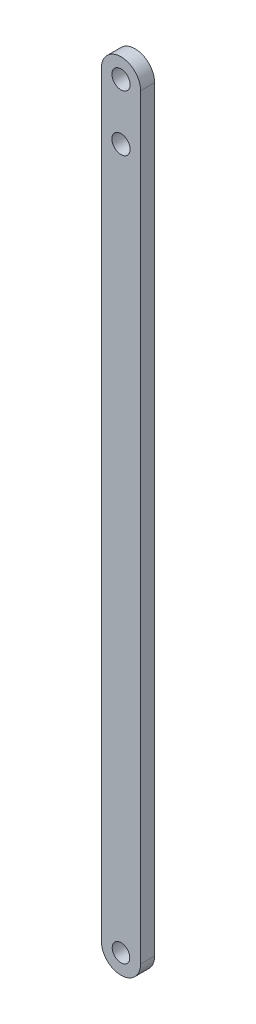
ISO-10303-21;
HEADER;
FILE_DESCRIPTION(('STEP AP214'),'2;1');
FILE_NAME('part.step','',(''),(''),'','','');
FILE_SCHEMA(('AUTOMOTIVE_DESIGN { 1 0 10303 214 1 1 1 1 }'));
ENDSEC;
DATA;
#1=APPLICATION_CONTEXT('core data for automotive mechanical design processes');
#2=APPLICATION_PROTOCOL_DEFINITION('international standard','automotive_design',2000,#1);
#3=PRODUCT_CONTEXT('',#1,'mechanical');
#4=PRODUCT('Part','Part','',(#3));
#5=PRODUCT_RELATED_PRODUCT_CATEGORY('part','',(#4));
#6=PRODUCT_DEFINITION_FORMATION('','',#4);
#7=PRODUCT_DEFINITION_CONTEXT('part definition',#1,'design');
#8=PRODUCT_DEFINITION('design','',#6,#7);
#9=PRODUCT_DEFINITION_SHAPE('','',#8);
#10=(LENGTH_UNIT() NAMED_UNIT(*) SI_UNIT(.MILLI.,.METRE.));
#11=(NAMED_UNIT(*) PLANE_ANGLE_UNIT() SI_UNIT($,.RADIAN.));
#12=(NAMED_UNIT(*) SI_UNIT($,.STERADIAN.) SOLID_ANGLE_UNIT());
#13=UNCERTAINTY_MEASURE_WITH_UNIT(LENGTH_MEASURE(1.E-05),#10,'distance_accuracy_value','');
#14=(GEOMETRIC_REPRESENTATION_CONTEXT(3) GLOBAL_UNCERTAINTY_ASSIGNED_CONTEXT((#13)) GLOBAL_UNIT_ASSIGNED_CONTEXT((#10,
#11,#12)) REPRESENTATION_CONTEXT('',''));
#15=CARTESIAN_POINT('',(0.,0.,0.));
#16=DIRECTION('',(0.,0.,1.));
#17=DIRECTION('',(1.,0.,0.));
#18=AXIS2_PLACEMENT_3D('',#15,#16,#17);
#19=CARTESIAN_POINT('',(0.,0.,5.));
#20=DIRECTION('',(0.,0.,1.));
#21=DIRECTION('',(1.,0.,0.));
#22=AXIS2_PLACEMENT_3D('',#19,#20,#21);
#23=PLANE('',#22);
#24=CARTESIAN_POINT('',(0.,270.,5.));
#25=DIRECTION('',(0.,0.,1.));
#26=DIRECTION('',(1.,0.,0.));
#27=AXIS2_PLACEMENT_3D('',#24,#25,#26);
#28=CIRCLE('',#27,3.25);
#29=CARTESIAN_POINT('',(3.25,270.,5.));
#30=VERTEX_POINT('',#29);
#31=EDGE_CURVE('E132',#30,#30,#28,.T.);
#32=ORIENTED_EDGE('',*,*,#31,.F.);
#33=EDGE_LOOP('',(#32));
#34=FACE_BOUND('',#33,.T.);
#35=CARTESIAN_POINT('',(0.,250.,5.));
#36=DIRECTION('',(0.,0.,1.));
#37=DIRECTION('',(1.,0.,0.));
#38=AXIS2_PLACEMENT_3D('',#35,#36,#37);
#39=CIRCLE('',#38,3.25);
#40=CARTESIAN_POINT('',(3.25,250.,5.));
#41=VERTEX_POINT('',#40);
#42=EDGE_CURVE('E140',#41,#41,#39,.T.);
#43=ORIENTED_EDGE('',*,*,#42,.F.);
#44=EDGE_LOOP('',(#43));
#45=FACE_BOUND('',#44,.T.);
#46=CARTESIAN_POINT('',(0.,0.,5.));
#47=DIRECTION('',(0.,0.,1.));
#48=DIRECTION('',(1.,0.,0.));
#49=AXIS2_PLACEMENT_3D('',#46,#47,#48);
#50=CIRCLE('',#49,7.00000000000002);
#51=CARTESIAN_POINT('',(-7.00000000000002,0.,5.));
#52=VERTEX_POINT('',#51);
#53=CARTESIAN_POINT('',(7.00000000000002,0.,5.));
#54=VERTEX_POINT('',#53);
#55=EDGE_CURVE('E98',#52,#54,#50,.T.);
#56=ORIENTED_EDGE('',*,*,#55,.T.);
#57=DIRECTION('',(0.,1.,0.));
#58=VECTOR('',#57,1.);
#59=CARTESIAN_POINT('',(7.,270.,5.));
#60=LINE('',#59,#58);
#61=CARTESIAN_POINT('',(6.99999999999999,270.,5.));
#62=VERTEX_POINT('',#61);
#63=EDGE_CURVE('E93',#54,#62,#60,.T.);
#64=ORIENTED_EDGE('',*,*,#63,.T.);
#65=CARTESIAN_POINT('',(0.,270.,5.));
#66=DIRECTION('',(0.,0.,1.));
#67=DIRECTION('',(1.,0.,0.));
#68=AXIS2_PLACEMENT_3D('',#65,#66,#67);
#69=CIRCLE('',#68,7.);
#70=CARTESIAN_POINT('',(-7.,270.,5.));
#71=VERTEX_POINT('',#70);
#72=EDGE_CURVE('E96',#62,#71,#69,.T.);
#73=ORIENTED_EDGE('',*,*,#72,.T.);
#74=DIRECTION('',(0.,-1.,0.));
#75=VECTOR('',#74,1.);
#76=CARTESIAN_POINT('',(-7.,270.,5.));
#77=LINE('',#76,#75);
#78=EDGE_CURVE('E63',#71,#52,#77,.T.);
#79=ORIENTED_EDGE('',*,*,#78,.T.);
#80=EDGE_LOOP('',(#56,#64,#73,#79));
#81=FACE_BOUND('',#80,.T.);
#82=CARTESIAN_POINT('',(0.,0.,5.));
#83=DIRECTION('',(0.,0.,1.));
#84=DIRECTION('',(1.,0.,0.));
#85=AXIS2_PLACEMENT_3D('',#82,#83,#84);
#86=CIRCLE('',#85,3.13055518278881);
#87=CARTESIAN_POINT('',(3.13055518278881,0.,5.));
#88=VERTEX_POINT('',#87);
#89=EDGE_CURVE('E119',#88,#88,#86,.T.);
#90=ORIENTED_EDGE('',*,*,#89,.F.);
#91=EDGE_LOOP('',(#90));
#92=FACE_BOUND('',#91,.T.);
#93=ADVANCED_FACE('F43',(#34,#45,#81,#92),#23,.T.);
#94=CARTESIAN_POINT('',(0.,0.,0.));
#95=DIRECTION('',(0.,0.,1.));
#96=DIRECTION('',(1.,0.,0.));
#97=AXIS2_PLACEMENT_3D('',#94,#95,#96);
#98=PLANE('',#97);
#99=CARTESIAN_POINT('',(0.,270.,0.));
#100=DIRECTION('',(0.,0.,1.));
#101=DIRECTION('',(1.,0.,0.));
#102=AXIS2_PLACEMENT_3D('',#99,#100,#101);
#103=CIRCLE('',#102,3.25);
#104=CARTESIAN_POINT('',(3.25,270.,0.));
#105=VERTEX_POINT('',#104);
#106=EDGE_CURVE('E47',#105,#105,#103,.T.);
#107=ORIENTED_EDGE('',*,*,#106,.T.);
#108=EDGE_LOOP('',(#107));
#109=FACE_BOUND('',#108,.T.);
#110=CARTESIAN_POINT('',(0.,250.,0.));
#111=DIRECTION('',(0.,0.,1.));
#112=DIRECTION('',(1.,0.,0.));
#113=AXIS2_PLACEMENT_3D('',#110,#111,#112);
#114=CIRCLE('',#113,3.25);
#115=CARTESIAN_POINT('',(3.25,250.,0.));
#116=VERTEX_POINT('',#115);
#117=EDGE_CURVE('E129',#116,#116,#114,.T.);
#118=ORIENTED_EDGE('',*,*,#117,.T.);
#119=EDGE_LOOP('',(#118));
#120=FACE_BOUND('',#119,.T.);
#121=CARTESIAN_POINT('',(0.,0.,0.));
#122=DIRECTION('',(0.,0.,1.));
#123=DIRECTION('',(1.,0.,0.));
#124=AXIS2_PLACEMENT_3D('',#121,#122,#123);
#125=CIRCLE('',#124,7.00000000000002);
#126=CARTESIAN_POINT('',(-7.00000000000002,0.,0.));
#127=VERTEX_POINT('',#126);
#128=CARTESIAN_POINT('',(7.00000000000002,0.,0.));
#129=VERTEX_POINT('',#128);
#130=EDGE_CURVE('E115',#127,#129,#125,.T.);
#131=ORIENTED_EDGE('',*,*,#130,.F.);
#132=DIRECTION('',(0.,-1.,0.));
#133=VECTOR('',#132,1.);
#134=CARTESIAN_POINT('',(-7.,270.,0.));
#135=LINE('',#134,#133);
#136=CARTESIAN_POINT('',(-7.,270.,0.));
#137=VERTEX_POINT('',#136);
#138=EDGE_CURVE('E86',#137,#127,#135,.T.);
#139=ORIENTED_EDGE('',*,*,#138,.F.);
#140=CARTESIAN_POINT('',(0.,270.,0.));
#141=DIRECTION('',(0.,0.,1.));
#142=DIRECTION('',(1.,0.,0.));
#143=AXIS2_PLACEMENT_3D('',#140,#141,#142);
#144=CIRCLE('',#143,7.);
#145=CARTESIAN_POINT('',(6.99999999999999,270.,0.));
#146=VERTEX_POINT('',#145);
#147=EDGE_CURVE('E80',#146,#137,#144,.T.);
#148=ORIENTED_EDGE('',*,*,#147,.F.);
#149=DIRECTION('',(0.,1.,0.));
#150=VECTOR('',#149,1.);
#151=CARTESIAN_POINT('',(7.,270.,0.));
#152=LINE('',#151,#150);
#153=EDGE_CURVE('E103',#129,#146,#152,.T.);
#154=ORIENTED_EDGE('',*,*,#153,.F.);
#155=EDGE_LOOP('',(#131,#139,#148,#154));
#156=FACE_BOUND('',#155,.T.);
#157=CARTESIAN_POINT('',(0.,0.,0.));
#158=DIRECTION('',(0.,0.,1.));
#159=DIRECTION('',(1.,0.,0.));
#160=AXIS2_PLACEMENT_3D('',#157,#158,#159);
#161=CIRCLE('',#160,3.13055518278881);
#162=CARTESIAN_POINT('',(3.13055518278881,0.,0.));
#163=VERTEX_POINT('',#162);
#164=EDGE_CURVE('E138',#163,#163,#161,.T.);
#165=ORIENTED_EDGE('',*,*,#164,.T.);
#166=EDGE_LOOP('',(#165));
#167=FACE_BOUND('',#166,.T.);
#168=ADVANCED_FACE('F156',(#109,#120,#156,#167),#98,.F.);
#169=CARTESIAN_POINT('',(0.,0.,5.));
#170=DIRECTION('',(0.,0.,-1.));
#171=DIRECTION('',(-1.,0.,0.));
#172=AXIS2_PLACEMENT_3D('',#169,#170,#171);
#173=CYLINDRICAL_SURFACE('',#172,7.00000000000002);
#174=ORIENTED_EDGE('',*,*,#130,.T.);
#175=DIRECTION('',(0.,0.,-1.));
#176=VECTOR('',#175,1.);
#177=CARTESIAN_POINT('',(7.00000000000002,0.,5.));
#178=LINE('',#177,#176);
#179=EDGE_CURVE('E11',#54,#129,#178,.T.);
#180=ORIENTED_EDGE('',*,*,#179,.F.);
#181=ORIENTED_EDGE('',*,*,#55,.F.);
#182=DIRECTION('',(0.,0.,-1.));
#183=VECTOR('',#182,1.);
#184=CARTESIAN_POINT('',(-7.00000000000002,0.,5.));
#185=LINE('',#184,#183);
#186=EDGE_CURVE('E111',#52,#127,#185,.T.);
#187=ORIENTED_EDGE('',*,*,#186,.T.);
#188=EDGE_LOOP('',(#174,#180,#181,#187));
#189=FACE_BOUND('',#188,.T.);
#190=ADVANCED_FACE('F45',(#189),#173,.T.);
#191=CARTESIAN_POINT('',(7.,270.,5.));
#192=DIRECTION('',(-1.,0.,0.));
#193=DIRECTION('',(0.,-1.,0.));
#194=AXIS2_PLACEMENT_3D('',#191,#192,#193);
#195=PLANE('',#194);
#196=ORIENTED_EDGE('',*,*,#153,.T.);
#197=DIRECTION('',(0.,0.,-1.));
#198=VECTOR('',#197,1.);
#199=CARTESIAN_POINT('',(6.99999999999999,270.,5.));
#200=LINE('',#199,#198);
#201=EDGE_CURVE('E54',#62,#146,#200,.T.);
#202=ORIENTED_EDGE('',*,*,#201,.F.);
#203=ORIENTED_EDGE('',*,*,#63,.F.);
#204=ORIENTED_EDGE('',*,*,#179,.T.);
#205=EDGE_LOOP('',(#196,#202,#203,#204));
#206=FACE_BOUND('',#205,.T.);
#207=ADVANCED_FACE('F102',(#206),#195,.F.);
#208=CARTESIAN_POINT('',(0.,270.,5.));
#209=DIRECTION('',(0.,0.,-1.));
#210=DIRECTION('',(-1.,0.,0.));
#211=AXIS2_PLACEMENT_3D('',#208,#209,#210);
#212=CYLINDRICAL_SURFACE('',#211,7.);
#213=ORIENTED_EDGE('',*,*,#147,.T.);
#214=DIRECTION('',(0.,0.,-1.));
#215=VECTOR('',#214,1.);
#216=CARTESIAN_POINT('',(-7.,270.,5.));
#217=LINE('',#216,#215);
#218=EDGE_CURVE('E105',#71,#137,#217,.T.);
#219=ORIENTED_EDGE('',*,*,#218,.F.);
#220=ORIENTED_EDGE('',*,*,#72,.F.);
#221=ORIENTED_EDGE('',*,*,#201,.T.);
#222=EDGE_LOOP('',(#213,#219,#220,#221));
#223=FACE_BOUND('',#222,.T.);
#224=ADVANCED_FACE('F107',(#223),#212,.T.);
#225=CARTESIAN_POINT('',(-7.,270.,5.));
#226=DIRECTION('',(1.,0.,0.));
#227=DIRECTION('',(0.,1.,0.));
#228=AXIS2_PLACEMENT_3D('',#225,#226,#227);
#229=PLANE('',#228);
#230=ORIENTED_EDGE('',*,*,#138,.T.);
#231=ORIENTED_EDGE('',*,*,#186,.F.);
#232=ORIENTED_EDGE('',*,*,#78,.F.);
#233=ORIENTED_EDGE('',*,*,#218,.T.);
#234=EDGE_LOOP('',(#230,#231,#232,#233));
#235=FACE_BOUND('',#234,.T.);
#236=ADVANCED_FACE('F161',(#235),#229,.F.);
#237=CARTESIAN_POINT('',(0.,0.,5.));
#238=DIRECTION('',(0.,0.,-1.));
#239=DIRECTION('',(-1.,0.,0.));
#240=AXIS2_PLACEMENT_3D('',#237,#238,#239);
#241=CYLINDRICAL_SURFACE('',#240,3.13055518278881);
#242=ORIENTED_EDGE('',*,*,#89,.T.);
#243=EDGE_LOOP('',(#242));
#244=FACE_BOUND('',#243,.T.);
#245=ORIENTED_EDGE('',*,*,#164,.F.);
#246=EDGE_LOOP('',(#245));
#247=FACE_BOUND('',#246,.T.);
#248=ADVANCED_FACE('F158',(#244,#247),#241,.F.);
#249=CARTESIAN_POINT('',(0.,250.,-5.));
#250=DIRECTION('',(0.,0.,1.));
#251=DIRECTION('',(1.,0.,0.));
#252=AXIS2_PLACEMENT_3D('',#249,#250,#251);
#253=CYLINDRICAL_SURFACE('',#252,3.25);
#254=ORIENTED_EDGE('',*,*,#42,.T.);
#255=EDGE_LOOP('',(#254));
#256=FACE_BOUND('',#255,.T.);
#257=ORIENTED_EDGE('',*,*,#117,.F.);
#258=EDGE_LOOP('',(#257));
#259=FACE_BOUND('',#258,.T.);
#260=ADVANCED_FACE('F160',(#256,#259),#253,.F.);
#261=CARTESIAN_POINT('',(0.,270.,-5.));
#262=DIRECTION('',(0.,0.,1.));
#263=DIRECTION('',(1.,0.,0.));
#264=AXIS2_PLACEMENT_3D('',#261,#262,#263);
#265=CYLINDRICAL_SURFACE('',#264,3.25);
#266=ORIENTED_EDGE('',*,*,#31,.T.);
#267=EDGE_LOOP('',(#266));
#268=FACE_BOUND('',#267,.T.);
#269=ORIENTED_EDGE('',*,*,#106,.F.);
#270=EDGE_LOOP('',(#269));
#271=FACE_BOUND('',#270,.T.);
#272=ADVANCED_FACE('F168',(#268,#271),#265,.F.);
#273=CLOSED_SHELL('',(#93,#168,#190,#207,#224,#236,#248,#260,#272));
#274=MANIFOLD_SOLID_BREP('B2',#273);
#275=ADVANCED_BREP_SHAPE_REPRESENTATION('',(#18,#274),#14);
#276=SHAPE_DEFINITION_REPRESENTATION(#9,#275);
ENDSEC;
END-ISO-10303-21;
